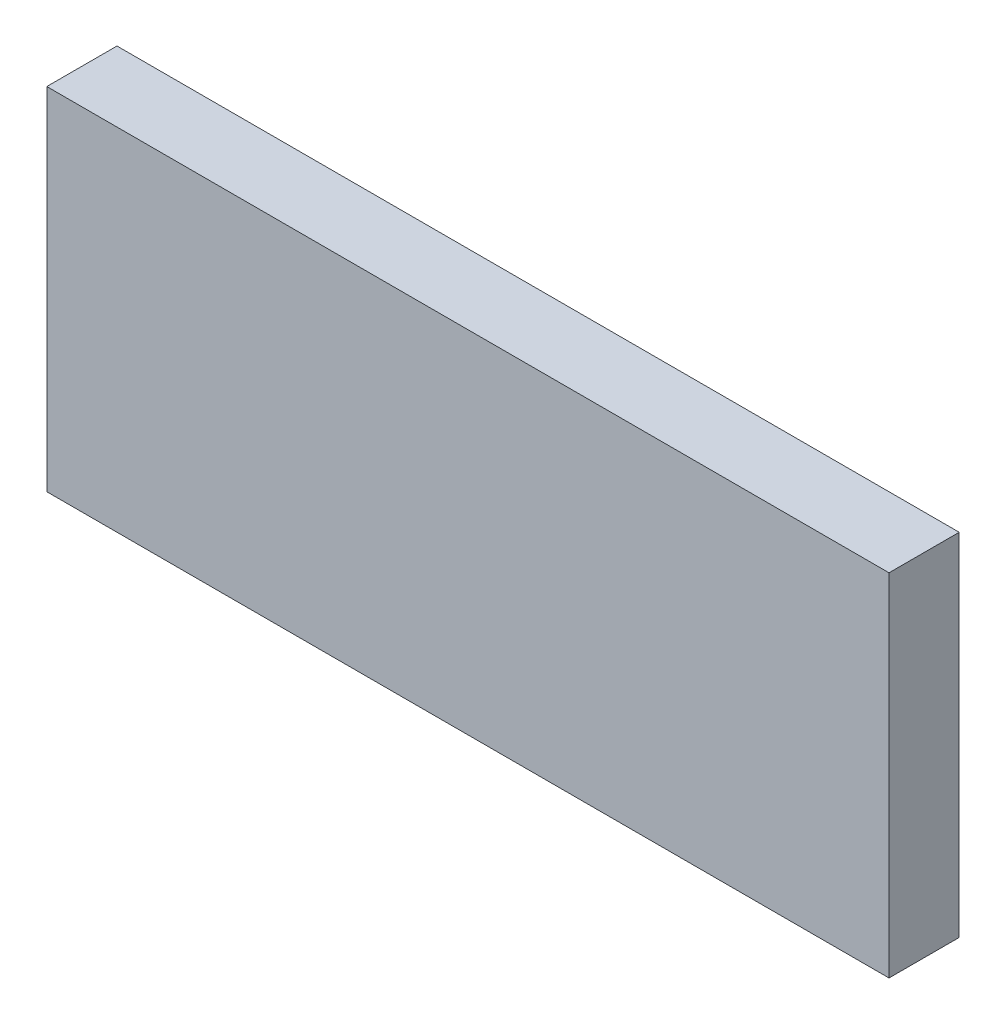
ISO-10303-21;
HEADER;
FILE_DESCRIPTION(('STEP AP214'),'2;1');
FILE_NAME('part.step','',(''),(''),'','','');
FILE_SCHEMA(('AUTOMOTIVE_DESIGN { 1 0 10303 214 1 1 1 1 }'));
ENDSEC;
DATA;
#1=APPLICATION_CONTEXT('core data for automotive mechanical design processes');
#2=APPLICATION_PROTOCOL_DEFINITION('international standard','automotive_design',2000,#1);
#3=PRODUCT_CONTEXT('',#1,'mechanical');
#4=PRODUCT('Part','Part','',(#3));
#5=PRODUCT_RELATED_PRODUCT_CATEGORY('part','',(#4));
#6=PRODUCT_DEFINITION_FORMATION('','',#4);
#7=PRODUCT_DEFINITION_CONTEXT('part definition',#1,'design');
#8=PRODUCT_DEFINITION('design','',#6,#7);
#9=PRODUCT_DEFINITION_SHAPE('','',#8);
#10=(LENGTH_UNIT() NAMED_UNIT(*) SI_UNIT(.MILLI.,.METRE.));
#11=(NAMED_UNIT(*) PLANE_ANGLE_UNIT() SI_UNIT($,.RADIAN.));
#12=(NAMED_UNIT(*) SI_UNIT($,.STERADIAN.) SOLID_ANGLE_UNIT());
#13=UNCERTAINTY_MEASURE_WITH_UNIT(LENGTH_MEASURE(1.E-05),#10,'distance_accuracy_value','');
#14=(GEOMETRIC_REPRESENTATION_CONTEXT(3) GLOBAL_UNCERTAINTY_ASSIGNED_CONTEXT((#13)) GLOBAL_UNIT_ASSIGNED_CONTEXT((#10,
#11,#12)) REPRESENTATION_CONTEXT('',''));
#15=CARTESIAN_POINT('',(0.,0.,0.));
#16=DIRECTION('',(0.,0.,1.));
#17=DIRECTION('',(1.,0.,0.));
#18=AXIS2_PLACEMENT_3D('',#15,#16,#17);
#19=CARTESIAN_POINT('',(0.,0.,15.));
#20=DIRECTION('',(1.,0.,0.));
#21=DIRECTION('',(0.,0.,-1.));
#22=AXIS2_PLACEMENT_3D('',#19,#20,#21);
#23=PLANE('',#22);
#24=DIRECTION('',(0.,-1.,0.));
#25=VECTOR('',#24,1.);
#26=CARTESIAN_POINT('',(0.,0.,0.));
#27=LINE('',#26,#25);
#28=CARTESIAN_POINT('',(0.,75.,0.));
#29=VERTEX_POINT('',#28);
#30=CARTESIAN_POINT('',(0.,0.,0.));
#31=VERTEX_POINT('',#30);
#32=EDGE_CURVE('E109',#29,#31,#27,.T.);
#33=ORIENTED_EDGE('',*,*,#32,.T.);
#34=DIRECTION('',(0.,0.,-1.));
#35=VECTOR('',#34,1.);
#36=CARTESIAN_POINT('',(0.,0.,15.));
#37=LINE('',#36,#35);
#38=CARTESIAN_POINT('',(0.,0.,15.));
#39=VERTEX_POINT('',#38);
#40=EDGE_CURVE('E11',#39,#31,#37,.T.);
#41=ORIENTED_EDGE('',*,*,#40,.F.);
#42=DIRECTION('',(0.,-1.,0.));
#43=VECTOR('',#42,1.);
#44=CARTESIAN_POINT('',(0.,0.,15.));
#45=LINE('',#44,#43);
#46=CARTESIAN_POINT('',(0.,75.,15.));
#47=VERTEX_POINT('',#46);
#48=EDGE_CURVE('E98',#47,#39,#45,.T.);
#49=ORIENTED_EDGE('',*,*,#48,.F.);
#50=DIRECTION('',(0.,0.,-1.));
#51=VECTOR('',#50,1.);
#52=CARTESIAN_POINT('',(0.,75.,15.));
#53=LINE('',#52,#51);
#54=EDGE_CURVE('E106',#47,#29,#53,.T.);
#55=ORIENTED_EDGE('',*,*,#54,.T.);
#56=EDGE_LOOP('',(#33,#41,#49,#55));
#57=FACE_BOUND('',#56,.T.);
#58=ADVANCED_FACE('F50',(#57),#23,.F.);
#59=CARTESIAN_POINT('',(0.,0.,15.));
#60=DIRECTION('',(0.,1.,0.));
#61=DIRECTION('',(0.,0.,1.));
#62=AXIS2_PLACEMENT_3D('',#59,#60,#61);
#63=PLANE('',#62);
#64=DIRECTION('',(1.,0.,0.));
#65=VECTOR('',#64,1.);
#66=CARTESIAN_POINT('',(0.,0.,0.));
#67=LINE('',#66,#65);
#68=CARTESIAN_POINT('',(180.,0.,0.));
#69=VERTEX_POINT('',#68);
#70=EDGE_CURVE('E105',#31,#69,#67,.T.);
#71=ORIENTED_EDGE('',*,*,#70,.T.);
#72=DIRECTION('',(0.,0.,-1.));
#73=VECTOR('',#72,1.);
#74=CARTESIAN_POINT('',(180.,0.,15.));
#75=LINE('',#74,#73);
#76=CARTESIAN_POINT('',(180.,0.,15.));
#77=VERTEX_POINT('',#76);
#78=EDGE_CURVE('E54',#77,#69,#75,.T.);
#79=ORIENTED_EDGE('',*,*,#78,.F.);
#80=DIRECTION('',(1.,0.,0.));
#81=VECTOR('',#80,1.);
#82=CARTESIAN_POINT('',(0.,0.,15.));
#83=LINE('',#82,#81);
#84=EDGE_CURVE('E91',#39,#77,#83,.T.);
#85=ORIENTED_EDGE('',*,*,#84,.F.);
#86=ORIENTED_EDGE('',*,*,#40,.T.);
#87=EDGE_LOOP('',(#71,#79,#85,#86));
#88=FACE_BOUND('',#87,.T.);
#89=ADVANCED_FACE('F101',(#88),#63,.F.);
#90=CARTESIAN_POINT('',(180.,0.,15.));
#91=DIRECTION('',(-1.,0.,0.));
#92=DIRECTION('',(0.,0.,1.));
#93=AXIS2_PLACEMENT_3D('',#90,#91,#92);
#94=PLANE('',#93);
#95=DIRECTION('',(0.,1.,0.));
#96=VECTOR('',#95,1.);
#97=CARTESIAN_POINT('',(180.,0.,0.));
#98=LINE('',#97,#96);
#99=CARTESIAN_POINT('',(180.,75.,0.));
#100=VERTEX_POINT('',#99);
#101=EDGE_CURVE('E78',#69,#100,#98,.T.);
#102=ORIENTED_EDGE('',*,*,#101,.T.);
#103=DIRECTION('',(0.,0.,-1.));
#104=VECTOR('',#103,1.);
#105=CARTESIAN_POINT('',(180.,75.,15.));
#106=LINE('',#105,#104);
#107=CARTESIAN_POINT('',(180.,75.,15.));
#108=VERTEX_POINT('',#107);
#109=EDGE_CURVE('E103',#108,#100,#106,.T.);
#110=ORIENTED_EDGE('',*,*,#109,.F.);
#111=DIRECTION('',(0.,1.,0.));
#112=VECTOR('',#111,1.);
#113=CARTESIAN_POINT('',(180.,0.,15.));
#114=LINE('',#113,#112);
#115=EDGE_CURVE('E96',#77,#108,#114,.T.);
#116=ORIENTED_EDGE('',*,*,#115,.F.);
#117=ORIENTED_EDGE('',*,*,#78,.T.);
#118=EDGE_LOOP('',(#102,#110,#116,#117));
#119=FACE_BOUND('',#118,.T.);
#120=ADVANCED_FACE('F102',(#119),#94,.F.);
#121=CARTESIAN_POINT('',(0.,75.,15.));
#122=DIRECTION('',(0.,-1.,0.));
#123=DIRECTION('',(0.,0.,-1.));
#124=AXIS2_PLACEMENT_3D('',#121,#122,#123);
#125=PLANE('',#124);
#126=DIRECTION('',(-1.,0.,0.));
#127=VECTOR('',#126,1.);
#128=CARTESIAN_POINT('',(0.,75.,0.));
#129=LINE('',#128,#127);
#130=EDGE_CURVE('E88',#100,#29,#129,.T.);
#131=ORIENTED_EDGE('',*,*,#130,.T.);
#132=ORIENTED_EDGE('',*,*,#54,.F.);
#133=DIRECTION('',(-1.,0.,0.));
#134=VECTOR('',#133,1.);
#135=CARTESIAN_POINT('',(0.,75.,15.));
#136=LINE('',#135,#134);
#137=EDGE_CURVE('E64',#108,#47,#136,.T.);
#138=ORIENTED_EDGE('',*,*,#137,.F.);
#139=ORIENTED_EDGE('',*,*,#109,.T.);
#140=EDGE_LOOP('',(#131,#132,#138,#139));
#141=FACE_BOUND('',#140,.T.);
#142=ADVANCED_FACE('F120',(#141),#125,.F.);
#143=CARTESIAN_POINT('',(0.,0.,15.));
#144=DIRECTION('',(0.,0.,-1.));
#145=DIRECTION('',(-1.,0.,0.));
#146=AXIS2_PLACEMENT_3D('',#143,#144,#145);
#147=PLANE('',#146);
#148=ORIENTED_EDGE('',*,*,#48,.T.);
#149=ORIENTED_EDGE('',*,*,#84,.T.);
#150=ORIENTED_EDGE('',*,*,#115,.T.);
#151=ORIENTED_EDGE('',*,*,#137,.T.);
#152=EDGE_LOOP('',(#148,#149,#150,#151));
#153=FACE_BOUND('',#152,.T.);
#154=ADVANCED_FACE('F94',(#153),#147,.F.);
#155=CARTESIAN_POINT('',(0.,0.,0.));
#156=DIRECTION('',(0.,0.,-1.));
#157=DIRECTION('',(-1.,0.,0.));
#158=AXIS2_PLACEMENT_3D('',#155,#156,#157);
#159=PLANE('',#158);
#160=ORIENTED_EDGE('',*,*,#32,.F.);
#161=ORIENTED_EDGE('',*,*,#130,.F.);
#162=ORIENTED_EDGE('',*,*,#101,.F.);
#163=ORIENTED_EDGE('',*,*,#70,.F.);
#164=EDGE_LOOP('',(#160,#161,#162,#163));
#165=FACE_BOUND('',#164,.T.);
#166=ADVANCED_FACE('F118',(#165),#159,.T.);
#167=CLOSED_SHELL('',(#58,#89,#120,#142,#154,#166));
#168=MANIFOLD_SOLID_BREP('B2',#167);
#169=ADVANCED_BREP_SHAPE_REPRESENTATION('',(#18,#168),#14);
#170=SHAPE_DEFINITION_REPRESENTATION(#9,#169);
ENDSEC;
END-ISO-10303-21;
